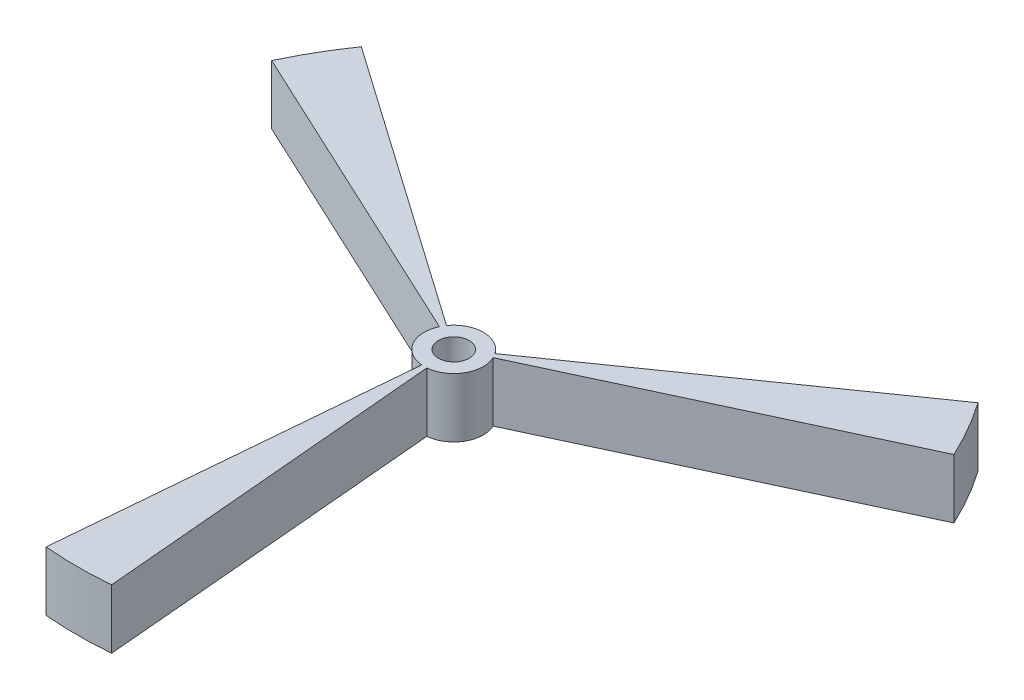
ISO-10303-21;
HEADER;
FILE_DESCRIPTION(('STEP AP214'),'2;1');
FILE_NAME('part.step','',(''),(''),'','','');
FILE_SCHEMA(('AUTOMOTIVE_DESIGN { 1 0 10303 214 1 1 1 1 }'));
ENDSEC;
DATA;
#1=APPLICATION_CONTEXT('core data for automotive mechanical design processes');
#2=APPLICATION_PROTOCOL_DEFINITION('international standard','automotive_design',2000,#1);
#3=PRODUCT_CONTEXT('',#1,'mechanical');
#4=PRODUCT('Part','Part','',(#3));
#5=PRODUCT_RELATED_PRODUCT_CATEGORY('part','',(#4));
#6=PRODUCT_DEFINITION_FORMATION('','',#4);
#7=PRODUCT_DEFINITION_CONTEXT('part definition',#1,'design');
#8=PRODUCT_DEFINITION('design','',#6,#7);
#9=PRODUCT_DEFINITION_SHAPE('','',#8);
#10=(LENGTH_UNIT() NAMED_UNIT(*) SI_UNIT(.MILLI.,.METRE.));
#11=(NAMED_UNIT(*) PLANE_ANGLE_UNIT() SI_UNIT($,.RADIAN.));
#12=(NAMED_UNIT(*) SI_UNIT($,.STERADIAN.) SOLID_ANGLE_UNIT());
#13=UNCERTAINTY_MEASURE_WITH_UNIT(LENGTH_MEASURE(1.E-05),#10,'distance_accuracy_value','');
#14=(GEOMETRIC_REPRESENTATION_CONTEXT(3) GLOBAL_UNCERTAINTY_ASSIGNED_CONTEXT((#13)) GLOBAL_UNIT_ASSIGNED_CONTEXT((#10,
#11,#12)) REPRESENTATION_CONTEXT('',''));
#15=CARTESIAN_POINT('',(0.,0.,0.));
#16=DIRECTION('',(0.,0.,1.));
#17=DIRECTION('',(1.,0.,0.));
#18=AXIS2_PLACEMENT_3D('',#15,#16,#17);
#19=CARTESIAN_POINT('',(0.,10.,0.));
#20=DIRECTION('',(0.,1.,0.));
#21=DIRECTION('',(0.,0.,1.));
#22=AXIS2_PLACEMENT_3D('',#19,#20,#21);
#23=PLANE('',#22);
#24=CARTESIAN_POINT('',(0.,10.,0.));
#25=DIRECTION('',(0.,1.,0.));
#26=DIRECTION('',(0.,0.,1.));
#27=AXIS2_PLACEMENT_3D('',#24,#25,#26);
#28=CIRCLE('',#27,2.6);
#29=CARTESIAN_POINT('',(0.,10.,2.6));
#30=VERTEX_POINT('',#29);
#31=EDGE_CURVE('E258',#30,#30,#28,.T.);
#32=ORIENTED_EDGE('',*,*,#31,.F.);
#33=EDGE_LOOP('',(#32));
#34=FACE_BOUND('',#33,.T.);
#35=CARTESIAN_POINT('',(0.,10.,0.));
#36=DIRECTION('',(0.,1.,0.));
#37=DIRECTION('',(0.,0.,1.));
#38=AXIS2_PLACEMENT_3D('',#35,#36,#37);
#39=CIRCLE('',#38,5.);
#40=CARTESIAN_POINT('',(4.09576022144495,10.,-2.86788218175525));
#41=VERTEX_POINT('',#40);
#42=CARTESIAN_POINT('',(-4.09576022144495,10.,-2.86788218175525));
#43=VERTEX_POINT('',#42);
#44=EDGE_CURVE('E180',#41,#43,#39,.T.);
#45=ORIENTED_EDGE('',*,*,#44,.T.);
#46=DIRECTION('',(-0.819152044288989,0.,-0.57357643635105));
#47=VECTOR('',#46,1.);
#48=CARTESIAN_POINT('',(0.,10.,0.));
#49=LINE('',#48,#47);
#50=CARTESIAN_POINT('',(-52.0161548123508,10.,-36.4221037082917));
#51=VERTEX_POINT('',#50);
#52=EDGE_CURVE('E194',#43,#51,#49,.T.);
#53=ORIENTED_EDGE('',*,*,#52,.T.);
#54=CARTESIAN_POINT('',(0.,10.,0.));
#55=DIRECTION('',(0.,1.,0.));
#56=DIRECTION('',(0.,0.,1.));
#57=AXIS2_PLACEMENT_3D('',#54,#55,#56);
#58=CIRCLE('',#57,63.5);
#59=CARTESIAN_POINT('',(-57.5505444768271,10.,-26.8362596205347));
#60=VERTEX_POINT('',#59);
#61=EDGE_CURVE('E90',#51,#60,#58,.T.);
#62=ORIENTED_EDGE('',*,*,#61,.T.);
#63=DIRECTION('',(-0.906307787036648,0.,-0.422618261740703));
#64=VECTOR('',#63,1.);
#65=CARTESIAN_POINT('',(0.,10.,0.));
#66=LINE('',#65,#64);
#67=CARTESIAN_POINT('',(-4.53153893518324,10.,-2.11309130870352));
#68=VERTEX_POINT('',#67);
#69=EDGE_CURVE('E218',#68,#60,#66,.T.);
#70=ORIENTED_EDGE('',*,*,#69,.F.);
#71=CARTESIAN_POINT('',(0.,10.,0.));
#72=DIRECTION('',(0.,1.,0.));
#73=DIRECTION('',(0.,0.,1.));
#74=AXIS2_PLACEMENT_3D('',#71,#72,#73);
#75=CIRCLE('',#74,5.);
#76=CARTESIAN_POINT('',(-0.435778713738291,10.,4.98097349045873));
#77=VERTEX_POINT('',#76);
#78=EDGE_CURVE('E203',#68,#77,#75,.T.);
#79=ORIENTED_EDGE('',*,*,#78,.T.);
#80=DIRECTION('',(-0.0871557427476583,0.,0.996194698091746));
#81=VECTOR('',#80,1.);
#82=CARTESIAN_POINT('',(0.,10.,0.));
#83=LINE('',#82,#81);
#84=CARTESIAN_POINT('',(-5.5343896644763,10.,63.2583633288258));
#85=VERTEX_POINT('',#84);
#86=EDGE_CURVE('E210',#77,#85,#83,.T.);
#87=ORIENTED_EDGE('',*,*,#86,.T.);
#88=CARTESIAN_POINT('',(5.53438966447631,10.,63.2583633288258));
#89=VERTEX_POINT('',#88);
#90=EDGE_CURVE('E91',#85,#89,#58,.T.);
#91=ORIENTED_EDGE('',*,*,#90,.T.);
#92=DIRECTION('',(0.0871557427476584,0.,0.996194698091746));
#93=VECTOR('',#92,1.);
#94=CARTESIAN_POINT('',(0.,10.,0.));
#95=LINE('',#94,#93);
#96=CARTESIAN_POINT('',(0.435778713738292,10.,4.98097349045873));
#97=VERTEX_POINT('',#96);
#98=EDGE_CURVE('E243',#97,#89,#95,.T.);
#99=ORIENTED_EDGE('',*,*,#98,.F.);
#100=CARTESIAN_POINT('',(0.,10.,0.));
#101=DIRECTION('',(0.,1.,0.));
#102=DIRECTION('',(0.,0.,1.));
#103=AXIS2_PLACEMENT_3D('',#100,#101,#102);
#104=CIRCLE('',#103,5.);
#105=CARTESIAN_POINT('',(4.53153893518324,10.,-2.11309130870352));
#106=VERTEX_POINT('',#105);
#107=EDGE_CURVE('E225',#97,#106,#104,.T.);
#108=ORIENTED_EDGE('',*,*,#107,.T.);
#109=DIRECTION('',(0.906307787036648,0.,-0.422618261740704));
#110=VECTOR('',#109,1.);
#111=CARTESIAN_POINT('',(0.,10.,0.));
#112=LINE('',#111,#110);
#113=CARTESIAN_POINT('',(57.5505444768271,10.,-26.8362596205347));
#114=VERTEX_POINT('',#113);
#115=EDGE_CURVE('E235',#106,#114,#112,.T.);
#116=ORIENTED_EDGE('',*,*,#115,.T.);
#117=CARTESIAN_POINT('',(52.0161548123508,10.,-36.4221037082917));
#118=VERTEX_POINT('',#117);
#119=EDGE_CURVE('E12',#114,#118,#58,.T.);
#120=ORIENTED_EDGE('',*,*,#119,.T.);
#121=DIRECTION('',(0.819152044288989,0.,-0.57357643635105));
#122=VECTOR('',#121,1.);
#123=CARTESIAN_POINT('',(0.,10.,0.));
#124=LINE('',#123,#122);
#125=EDGE_CURVE('E98',#41,#118,#124,.T.);
#126=ORIENTED_EDGE('',*,*,#125,.F.);
#127=EDGE_LOOP('',(#45,#53,#62,#70,#79,#87,#91,#99,#108,#116,#120,#126));
#128=FACE_BOUND('',#127,.T.);
#129=ADVANCED_FACE('F81',(#34,#128),#23,.T.);
#130=CARTESIAN_POINT('',(0.,0.,0.));
#131=DIRECTION('',(0.,1.,0.));
#132=DIRECTION('',(0.,0.,1.));
#133=AXIS2_PLACEMENT_3D('',#130,#131,#132);
#134=PLANE('',#133);
#135=CARTESIAN_POINT('',(0.,0.,0.));
#136=DIRECTION('',(0.,1.,0.));
#137=DIRECTION('',(0.,0.,1.));
#138=AXIS2_PLACEMENT_3D('',#135,#136,#137);
#139=CIRCLE('',#138,2.6);
#140=CARTESIAN_POINT('',(0.,0.,2.6));
#141=VERTEX_POINT('',#140);
#142=EDGE_CURVE('E251',#141,#141,#139,.T.);
#143=ORIENTED_EDGE('',*,*,#142,.T.);
#144=EDGE_LOOP('',(#143));
#145=FACE_BOUND('',#144,.T.);
#146=DIRECTION('',(-0.819152044288989,0.,-0.57357643635105));
#147=VECTOR('',#146,1.);
#148=CARTESIAN_POINT('',(0.,0.,0.));
#149=LINE('',#148,#147);
#150=CARTESIAN_POINT('',(-4.09576022144495,0.,-2.86788218175525));
#151=VERTEX_POINT('',#150);
#152=CARTESIAN_POINT('',(-52.0161548123508,0.,-36.4221037082917));
#153=VERTEX_POINT('',#152);
#154=EDGE_CURVE('E182',#151,#153,#149,.T.);
#155=ORIENTED_EDGE('',*,*,#154,.F.);
#156=CARTESIAN_POINT('',(0.,0.,0.));
#157=DIRECTION('',(0.,1.,0.));
#158=DIRECTION('',(0.,0.,1.));
#159=AXIS2_PLACEMENT_3D('',#156,#157,#158);
#160=CIRCLE('',#159,5.);
#161=CARTESIAN_POINT('',(4.09576022144495,0.,-2.86788218175525));
#162=VERTEX_POINT('',#161);
#163=EDGE_CURVE('E177',#162,#151,#160,.T.);
#164=ORIENTED_EDGE('',*,*,#163,.F.);
#165=DIRECTION('',(0.819152044288989,0.,-0.57357643635105));
#166=VECTOR('',#165,1.);
#167=CARTESIAN_POINT('',(0.,0.,0.));
#168=LINE('',#167,#166);
#169=CARTESIAN_POINT('',(52.0161548123508,0.,-36.4221037082917));
#170=VERTEX_POINT('',#169);
#171=EDGE_CURVE('E185',#162,#170,#168,.T.);
#172=ORIENTED_EDGE('',*,*,#171,.T.);
#173=CARTESIAN_POINT('',(0.,0.,0.));
#174=DIRECTION('',(0.,1.,0.));
#175=DIRECTION('',(0.,0.,1.));
#176=AXIS2_PLACEMENT_3D('',#173,#174,#175);
#177=CIRCLE('',#176,63.5);
#178=CARTESIAN_POINT('',(57.5505444768271,0.,-26.8362596205347));
#179=VERTEX_POINT('',#178);
#180=EDGE_CURVE('E85',#179,#170,#177,.T.);
#181=ORIENTED_EDGE('',*,*,#180,.F.);
#182=DIRECTION('',(0.906307787036648,0.,-0.422618261740704));
#183=VECTOR('',#182,1.);
#184=CARTESIAN_POINT('',(0.,0.,0.));
#185=LINE('',#184,#183);
#186=CARTESIAN_POINT('',(4.53153893518324,0.,-2.11309130870352));
#187=VERTEX_POINT('',#186);
#188=EDGE_CURVE('E238',#187,#179,#185,.T.);
#189=ORIENTED_EDGE('',*,*,#188,.F.);
#190=CARTESIAN_POINT('',(0.,0.,0.));
#191=DIRECTION('',(0.,1.,0.));
#192=DIRECTION('',(0.,0.,1.));
#193=AXIS2_PLACEMENT_3D('',#190,#191,#192);
#194=CIRCLE('',#193,5.);
#195=CARTESIAN_POINT('',(0.435778713738292,0.,4.98097349045873));
#196=VERTEX_POINT('',#195);
#197=EDGE_CURVE('E232',#196,#187,#194,.T.);
#198=ORIENTED_EDGE('',*,*,#197,.F.);
#199=DIRECTION('',(0.0871557427476584,0.,0.996194698091746));
#200=VECTOR('',#199,1.);
#201=CARTESIAN_POINT('',(0.,0.,0.));
#202=LINE('',#201,#200);
#203=CARTESIAN_POINT('',(5.53438966447631,0.,63.2583633288258));
#204=VERTEX_POINT('',#203);
#205=EDGE_CURVE('E234',#196,#204,#202,.T.);
#206=ORIENTED_EDGE('',*,*,#205,.T.);
#207=CARTESIAN_POINT('',(-5.5343896644763,0.,63.2583633288258));
#208=VERTEX_POINT('',#207);
#209=EDGE_CURVE('E261',#208,#204,#177,.T.);
#210=ORIENTED_EDGE('',*,*,#209,.F.);
#211=DIRECTION('',(-0.0871557427476583,0.,0.996194698091746));
#212=VECTOR('',#211,1.);
#213=CARTESIAN_POINT('',(0.,0.,0.));
#214=LINE('',#213,#212);
#215=CARTESIAN_POINT('',(-0.435778713738291,0.,4.98097349045873));
#216=VERTEX_POINT('',#215);
#217=EDGE_CURVE('E213',#216,#208,#214,.T.);
#218=ORIENTED_EDGE('',*,*,#217,.F.);
#219=CARTESIAN_POINT('',(0.,0.,0.));
#220=DIRECTION('',(0.,1.,0.));
#221=DIRECTION('',(0.,0.,1.));
#222=AXIS2_PLACEMENT_3D('',#219,#220,#221);
#223=CIRCLE('',#222,5.);
#224=CARTESIAN_POINT('',(-4.53153893518324,0.,-2.11309130870352));
#225=VERTEX_POINT('',#224);
#226=EDGE_CURVE('E207',#225,#216,#223,.T.);
#227=ORIENTED_EDGE('',*,*,#226,.F.);
#228=DIRECTION('',(-0.906307787036648,0.,-0.422618261740703));
#229=VECTOR('',#228,1.);
#230=CARTESIAN_POINT('',(0.,0.,0.));
#231=LINE('',#230,#229);
#232=CARTESIAN_POINT('',(-57.5505444768271,0.,-26.8362596205347));
#233=VERTEX_POINT('',#232);
#234=EDGE_CURVE('E209',#225,#233,#231,.T.);
#235=ORIENTED_EDGE('',*,*,#234,.T.);
#236=EDGE_CURVE('E292',#153,#233,#177,.T.);
#237=ORIENTED_EDGE('',*,*,#236,.F.);
#238=EDGE_LOOP('',(#155,#164,#172,#181,#189,#198,#206,#210,#218,#227,#235,#237));
#239=FACE_BOUND('',#238,.T.);
#240=ADVANCED_FACE('F192',(#145,#239),#134,.F.);
#241=CARTESIAN_POINT('',(0.,10.,0.));
#242=DIRECTION('',(0.,-1.,0.));
#243=DIRECTION('',(0.,0.,-1.));
#244=AXIS2_PLACEMENT_3D('',#241,#242,#243);
#245=CYLINDRICAL_SURFACE('',#244,63.5);
#246=DIRECTION('',(0.,1.,0.));
#247=VECTOR('',#246,1.);
#248=CARTESIAN_POINT('',(-52.0161548123508,0.,-36.4221037082917));
#249=LINE('',#248,#247);
#250=EDGE_CURVE('E204',#153,#51,#249,.T.);
#251=ORIENTED_EDGE('',*,*,#250,.F.);
#252=ORIENTED_EDGE('',*,*,#236,.T.);
#253=DIRECTION('',(0.,1.,0.));
#254=VECTOR('',#253,1.);
#255=CARTESIAN_POINT('',(-57.5505444768271,0.,-26.8362596205347));
#256=LINE('',#255,#254);
#257=EDGE_CURVE('E228',#233,#60,#256,.T.);
#258=ORIENTED_EDGE('',*,*,#257,.T.);
#259=ORIENTED_EDGE('',*,*,#61,.F.);
#260=EDGE_LOOP('',(#251,#252,#258,#259));
#261=FACE_BOUND('',#260,.T.);
#262=ADVANCED_FACE('F281',(#261),#245,.T.);
#263=DIRECTION('',(0.,1.,0.));
#264=VECTOR('',#263,1.);
#265=CARTESIAN_POINT('',(-5.5343896644763,0.,63.2583633288258));
#266=LINE('',#265,#264);
#267=EDGE_CURVE('E226',#208,#85,#266,.T.);
#268=ORIENTED_EDGE('',*,*,#267,.F.);
#269=ORIENTED_EDGE('',*,*,#209,.T.);
#270=DIRECTION('',(0.,1.,0.));
#271=VECTOR('',#270,1.);
#272=CARTESIAN_POINT('',(5.53438966447631,0.,63.2583633288258));
#273=LINE('',#272,#271);
#274=EDGE_CURVE('E254',#204,#89,#273,.T.);
#275=ORIENTED_EDGE('',*,*,#274,.T.);
#276=ORIENTED_EDGE('',*,*,#90,.F.);
#277=EDGE_LOOP('',(#268,#269,#275,#276));
#278=FACE_BOUND('',#277,.T.);
#279=ADVANCED_FACE('F279',(#278),#245,.T.);
#280=ORIENTED_EDGE('',*,*,#180,.T.);
#281=DIRECTION('',(0.,1.,0.));
#282=VECTOR('',#281,1.);
#283=CARTESIAN_POINT('',(52.0161548123508,0.,-36.4221037082917));
#284=LINE('',#283,#282);
#285=EDGE_CURVE('E181',#170,#118,#284,.T.);
#286=ORIENTED_EDGE('',*,*,#285,.T.);
#287=ORIENTED_EDGE('',*,*,#119,.F.);
#288=DIRECTION('',(0.,1.,0.));
#289=VECTOR('',#288,1.);
#290=CARTESIAN_POINT('',(57.5505444768271,0.,-26.8362596205347));
#291=LINE('',#290,#289);
#292=EDGE_CURVE('E252',#179,#114,#291,.T.);
#293=ORIENTED_EDGE('',*,*,#292,.F.);
#294=EDGE_LOOP('',(#280,#286,#287,#293));
#295=FACE_BOUND('',#294,.T.);
#296=ADVANCED_FACE('F83',(#295),#245,.T.);
#297=CARTESIAN_POINT('',(0.,10.,0.));
#298=DIRECTION('',(0.,-1.,0.));
#299=DIRECTION('',(0.,0.,-1.));
#300=AXIS2_PLACEMENT_3D('',#297,#298,#299);
#301=CYLINDRICAL_SURFACE('',#300,2.6);
#302=ORIENTED_EDGE('',*,*,#31,.T.);
#303=EDGE_LOOP('',(#302));
#304=FACE_BOUND('',#303,.T.);
#305=ORIENTED_EDGE('',*,*,#142,.F.);
#306=EDGE_LOOP('',(#305));
#307=FACE_BOUND('',#306,.T.);
#308=ADVANCED_FACE('F266',(#304,#307),#301,.F.);
#309=CARTESIAN_POINT('',(0.,0.,0.));
#310=DIRECTION('',(0.,1.,0.));
#311=DIRECTION('',(0.,0.,1.));
#312=AXIS2_PLACEMENT_3D('',#309,#310,#311);
#313=CYLINDRICAL_SURFACE('',#312,5.);
#314=ORIENTED_EDGE('',*,*,#107,.F.);
#315=DIRECTION('',(0.,1.,0.));
#316=VECTOR('',#315,1.);
#317=CARTESIAN_POINT('',(0.435778713738292,0.,4.98097349045873));
#318=LINE('',#317,#316);
#319=EDGE_CURVE('E240',#196,#97,#318,.T.);
#320=ORIENTED_EDGE('',*,*,#319,.F.);
#321=ORIENTED_EDGE('',*,*,#197,.T.);
#322=DIRECTION('',(0.,1.,0.));
#323=VECTOR('',#322,1.);
#324=CARTESIAN_POINT('',(4.53153893518324,0.,-2.11309130870352));
#325=LINE('',#324,#323);
#326=EDGE_CURVE('E248',#187,#106,#325,.T.);
#327=ORIENTED_EDGE('',*,*,#326,.T.);
#328=EDGE_LOOP('',(#314,#320,#321,#327));
#329=FACE_BOUND('',#328,.T.);
#330=ADVANCED_FACE('F268',(#329),#313,.T.);
#331=CARTESIAN_POINT('',(0.,0.,0.));
#332=DIRECTION('',(0.422618261740704,0.,0.906307787036648));
#333=DIRECTION('',(0.906307787036648,0.,-0.422618261740704));
#334=AXIS2_PLACEMENT_3D('',#331,#332,#333);
#335=PLANE('',#334);
#336=ORIENTED_EDGE('',*,*,#115,.F.);
#337=ORIENTED_EDGE('',*,*,#326,.F.);
#338=ORIENTED_EDGE('',*,*,#188,.T.);
#339=ORIENTED_EDGE('',*,*,#292,.T.);
#340=EDGE_LOOP('',(#336,#337,#338,#339));
#341=FACE_BOUND('',#340,.T.);
#342=ADVANCED_FACE('F275',(#341),#335,.T.);
#343=CARTESIAN_POINT('',(0.,0.,0.));
#344=DIRECTION('',(-0.996194698091746,0.,0.0871557427476584));
#345=DIRECTION('',(0.0871557427476584,0.,0.996194698091746));
#346=AXIS2_PLACEMENT_3D('',#343,#344,#345);
#347=PLANE('',#346);
#348=ORIENTED_EDGE('',*,*,#98,.T.);
#349=ORIENTED_EDGE('',*,*,#274,.F.);
#350=ORIENTED_EDGE('',*,*,#205,.F.);
#351=ORIENTED_EDGE('',*,*,#319,.T.);
#352=EDGE_LOOP('',(#348,#349,#350,#351));
#353=FACE_BOUND('',#352,.T.);
#354=ADVANCED_FACE('F301',(#353),#347,.F.);
#355=CARTESIAN_POINT('',(0.,0.,0.));
#356=DIRECTION('',(0.,1.,0.));
#357=DIRECTION('',(0.,0.,1.));
#358=AXIS2_PLACEMENT_3D('',#355,#356,#357);
#359=CYLINDRICAL_SURFACE('',#358,5.);
#360=ORIENTED_EDGE('',*,*,#78,.F.);
#361=DIRECTION('',(0.,1.,0.));
#362=VECTOR('',#361,1.);
#363=CARTESIAN_POINT('',(-4.53153893518324,0.,-2.11309130870352));
#364=LINE('',#363,#362);
#365=EDGE_CURVE('E215',#225,#68,#364,.T.);
#366=ORIENTED_EDGE('',*,*,#365,.F.);
#367=ORIENTED_EDGE('',*,*,#226,.T.);
#368=DIRECTION('',(0.,1.,0.));
#369=VECTOR('',#368,1.);
#370=CARTESIAN_POINT('',(-0.435778713738291,0.,4.98097349045873));
#371=LINE('',#370,#369);
#372=EDGE_CURVE('E222',#216,#77,#371,.T.);
#373=ORIENTED_EDGE('',*,*,#372,.T.);
#374=EDGE_LOOP('',(#360,#366,#367,#373));
#375=FACE_BOUND('',#374,.T.);
#376=ADVANCED_FACE('F312',(#375),#359,.T.);
#377=CARTESIAN_POINT('',(0.,0.,0.));
#378=DIRECTION('',(-0.996194698091746,0.,-0.0871557427476583));
#379=DIRECTION('',(-0.0871557427476583,0.,0.996194698091746));
#380=AXIS2_PLACEMENT_3D('',#377,#378,#379);
#381=PLANE('',#380);
#382=ORIENTED_EDGE('',*,*,#86,.F.);
#383=ORIENTED_EDGE('',*,*,#372,.F.);
#384=ORIENTED_EDGE('',*,*,#217,.T.);
#385=ORIENTED_EDGE('',*,*,#267,.T.);
#386=EDGE_LOOP('',(#382,#383,#384,#385));
#387=FACE_BOUND('',#386,.T.);
#388=ADVANCED_FACE('F317',(#387),#381,.T.);
#389=CARTESIAN_POINT('',(0.,0.,0.));
#390=DIRECTION('',(0.422618261740703,0.,-0.906307787036648));
#391=DIRECTION('',(-0.906307787036648,0.,-0.422618261740703));
#392=AXIS2_PLACEMENT_3D('',#389,#390,#391);
#393=PLANE('',#392);
#394=ORIENTED_EDGE('',*,*,#69,.T.);
#395=ORIENTED_EDGE('',*,*,#257,.F.);
#396=ORIENTED_EDGE('',*,*,#234,.F.);
#397=ORIENTED_EDGE('',*,*,#365,.T.);
#398=EDGE_LOOP('',(#394,#395,#396,#397));
#399=FACE_BOUND('',#398,.T.);
#400=ADVANCED_FACE('F319',(#399),#393,.F.);
#401=CARTESIAN_POINT('',(0.,0.,0.));
#402=DIRECTION('',(0.,1.,0.));
#403=DIRECTION('',(0.,0.,1.));
#404=AXIS2_PLACEMENT_3D('',#401,#402,#403);
#405=CYLINDRICAL_SURFACE('',#404,5.);
#406=ORIENTED_EDGE('',*,*,#44,.F.);
#407=DIRECTION('',(0.,1.,0.));
#408=VECTOR('',#407,1.);
#409=CARTESIAN_POINT('',(4.09576022144495,0.,-2.86788218175525));
#410=LINE('',#409,#408);
#411=EDGE_CURVE('E172',#162,#41,#410,.T.);
#412=ORIENTED_EDGE('',*,*,#411,.F.);
#413=ORIENTED_EDGE('',*,*,#163,.T.);
#414=DIRECTION('',(0.,1.,0.));
#415=VECTOR('',#414,1.);
#416=CARTESIAN_POINT('',(-4.09576022144495,0.,-2.86788218175525));
#417=LINE('',#416,#415);
#418=EDGE_CURVE('E201',#151,#43,#417,.T.);
#419=ORIENTED_EDGE('',*,*,#418,.T.);
#420=EDGE_LOOP('',(#406,#412,#413,#419));
#421=FACE_BOUND('',#420,.T.);
#422=ADVANCED_FACE('F174',(#421),#405,.T.);
#423=CARTESIAN_POINT('',(0.,0.,0.));
#424=DIRECTION('',(0.57357643635105,0.,-0.819152044288989));
#425=DIRECTION('',(-0.819152044288989,0.,-0.57357643635105));
#426=AXIS2_PLACEMENT_3D('',#423,#424,#425);
#427=PLANE('',#426);
#428=ORIENTED_EDGE('',*,*,#52,.F.);
#429=ORIENTED_EDGE('',*,*,#418,.F.);
#430=ORIENTED_EDGE('',*,*,#154,.T.);
#431=ORIENTED_EDGE('',*,*,#250,.T.);
#432=EDGE_LOOP('',(#428,#429,#430,#431));
#433=FACE_BOUND('',#432,.T.);
#434=ADVANCED_FACE('F328',(#433),#427,.T.);
#435=CARTESIAN_POINT('',(0.,0.,0.));
#436=DIRECTION('',(0.57357643635105,0.,0.819152044288989));
#437=DIRECTION('',(0.819152044288989,0.,-0.57357643635105));
#438=AXIS2_PLACEMENT_3D('',#435,#436,#437);
#439=PLANE('',#438);
#440=ORIENTED_EDGE('',*,*,#125,.T.);
#441=ORIENTED_EDGE('',*,*,#285,.F.);
#442=ORIENTED_EDGE('',*,*,#171,.F.);
#443=ORIENTED_EDGE('',*,*,#411,.T.);
#444=EDGE_LOOP('',(#440,#441,#442,#443));
#445=FACE_BOUND('',#444,.T.);
#446=ADVANCED_FACE('F186',(#445),#439,.F.);
#447=CLOSED_SHELL('',(#129,#240,#262,#279,#296,#308,#330,#342,#354,#376,#388,#400,#422,#434,#446));
#448=MANIFOLD_SOLID_BREP('B2',#447);
#449=ADVANCED_BREP_SHAPE_REPRESENTATION('',(#18,#448),#14);
#450=SHAPE_DEFINITION_REPRESENTATION(#9,#449);
ENDSEC;
END-ISO-10303-21;
